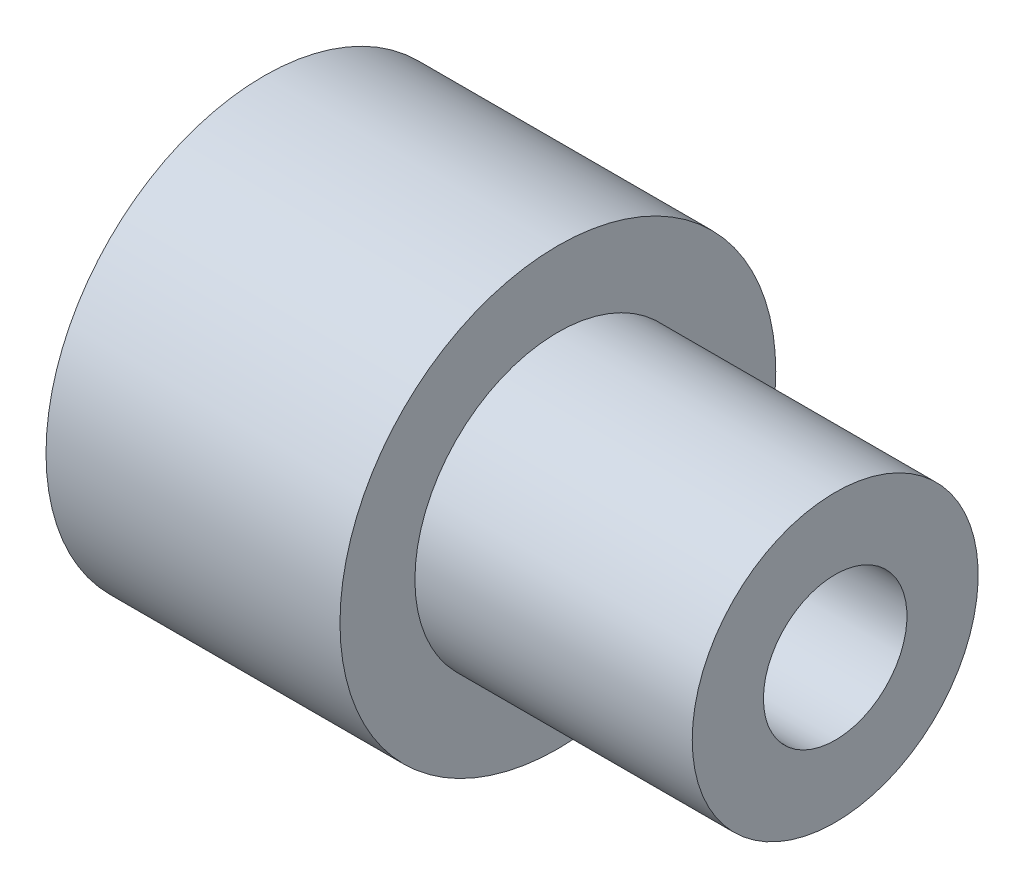
ISO-10303-21;
HEADER;
FILE_DESCRIPTION(('STEP AP214'),'2;1');
FILE_NAME('part.step','',(''),(''),'','','');
FILE_SCHEMA(('AUTOMOTIVE_DESIGN { 1 0 10303 214 1 1 1 1 }'));
ENDSEC;
DATA;
#1=APPLICATION_CONTEXT('core data for automotive mechanical design processes');
#2=APPLICATION_PROTOCOL_DEFINITION('international standard','automotive_design',2000,#1);
#3=PRODUCT_CONTEXT('',#1,'mechanical');
#4=PRODUCT('Part','Part','',(#3));
#5=PRODUCT_RELATED_PRODUCT_CATEGORY('part','',(#4));
#6=PRODUCT_DEFINITION_FORMATION('','',#4);
#7=PRODUCT_DEFINITION_CONTEXT('part definition',#1,'design');
#8=PRODUCT_DEFINITION('design','',#6,#7);
#9=PRODUCT_DEFINITION_SHAPE('','',#8);
#10=(LENGTH_UNIT() NAMED_UNIT(*) SI_UNIT(.MILLI.,.METRE.));
#11=(NAMED_UNIT(*) PLANE_ANGLE_UNIT() SI_UNIT($,.RADIAN.));
#12=(NAMED_UNIT(*) SI_UNIT($,.STERADIAN.) SOLID_ANGLE_UNIT());
#13=UNCERTAINTY_MEASURE_WITH_UNIT(LENGTH_MEASURE(1.E-05),#10,'distance_accuracy_value','');
#14=(GEOMETRIC_REPRESENTATION_CONTEXT(3) GLOBAL_UNCERTAINTY_ASSIGNED_CONTEXT((#13)) GLOBAL_UNIT_ASSIGNED_CONTEXT((#10,
#11,#12)) REPRESENTATION_CONTEXT('',''));
#15=CARTESIAN_POINT('',(0.,0.,0.));
#16=DIRECTION('',(0.,0.,1.));
#17=DIRECTION('',(1.,0.,0.));
#18=AXIS2_PLACEMENT_3D('',#15,#16,#17);
#19=CARTESIAN_POINT('',(0.,0.,0.));
#20=DIRECTION('',(1.,0.,0.));
#21=DIRECTION('',(0.,0.,-1.));
#22=AXIS2_PLACEMENT_3D('',#19,#20,#21);
#23=PLANE('',#22);
#24=CARTESIAN_POINT('',(0.,0.,0.));
#25=DIRECTION('',(-1.,0.,0.));
#26=DIRECTION('',(0.,0.,1.));
#27=AXIS2_PLACEMENT_3D('',#24,#25,#26);
#28=CIRCLE('',#27,1.24999999999999);
#29=CARTESIAN_POINT('',(0.,0.,1.24999999999999));
#30=VERTEX_POINT('',#29);
#31=EDGE_CURVE('E56',#30,#30,#28,.T.);
#32=ORIENTED_EDGE('',*,*,#31,.F.);
#33=EDGE_LOOP('',(#32));
#34=FACE_BOUND('',#33,.T.);
#35=CARTESIAN_POINT('',(0.,0.,0.));
#36=DIRECTION('',(-1.,0.,0.));
#37=DIRECTION('',(0.,0.,1.));
#38=AXIS2_PLACEMENT_3D('',#35,#36,#37);
#39=CIRCLE('',#38,3.795);
#40=CARTESIAN_POINT('',(0.,0.,3.795));
#41=VERTEX_POINT('',#40);
#42=EDGE_CURVE('E10',#41,#41,#39,.T.);
#43=ORIENTED_EDGE('',*,*,#42,.T.);
#44=EDGE_LOOP('',(#43));
#45=FACE_BOUND('',#44,.T.);
#46=ADVANCED_FACE('F34',(#34,#45),#23,.F.);
#47=CARTESIAN_POINT('',(0.,0.,0.));
#48=DIRECTION('',(-1.,0.,0.));
#49=DIRECTION('',(0.,0.,1.));
#50=AXIS2_PLACEMENT_3D('',#47,#48,#49);
#51=CYLINDRICAL_SURFACE('',#50,3.795);
#52=ORIENTED_EDGE('',*,*,#42,.F.);
#53=EDGE_LOOP('',(#52));
#54=FACE_BOUND('',#53,.T.);
#55=CARTESIAN_POINT('',(5.12,0.,0.));
#56=DIRECTION('',(-1.,0.,0.));
#57=DIRECTION('',(0.,0.,1.));
#58=AXIS2_PLACEMENT_3D('',#55,#56,#57);
#59=CIRCLE('',#58,3.795);
#60=CARTESIAN_POINT('',(5.12,0.,3.795));
#61=VERTEX_POINT('',#60);
#62=EDGE_CURVE('E40',#61,#61,#59,.T.);
#63=ORIENTED_EDGE('',*,*,#62,.T.);
#64=EDGE_LOOP('',(#63));
#65=FACE_BOUND('',#64,.T.);
#66=ADVANCED_FACE('F63',(#54,#65),#51,.T.);
#67=CARTESIAN_POINT('',(5.12,3.795,0.));
#68=DIRECTION('',(-1.,0.,0.));
#69=DIRECTION('',(0.,0.,1.));
#70=AXIS2_PLACEMENT_3D('',#67,#68,#69);
#71=PLANE('',#70);
#72=ORIENTED_EDGE('',*,*,#62,.F.);
#73=EDGE_LOOP('',(#72));
#74=FACE_BOUND('',#73,.T.);
#75=CARTESIAN_POINT('',(5.12,0.,0.));
#76=DIRECTION('',(-1.,0.,0.));
#77=DIRECTION('',(0.,0.,1.));
#78=AXIS2_PLACEMENT_3D('',#75,#76,#77);
#79=CIRCLE('',#78,2.49);
#80=CARTESIAN_POINT('',(5.12,0.,2.49));
#81=VERTEX_POINT('',#80);
#82=EDGE_CURVE('E44',#81,#81,#79,.T.);
#83=ORIENTED_EDGE('',*,*,#82,.T.);
#84=EDGE_LOOP('',(#83));
#85=FACE_BOUND('',#84,.T.);
#86=ADVANCED_FACE('F67',(#74,#85),#71,.F.);
#87=CARTESIAN_POINT('',(0.,0.,0.));
#88=DIRECTION('',(-1.,0.,0.));
#89=DIRECTION('',(0.,0.,1.));
#90=AXIS2_PLACEMENT_3D('',#87,#88,#89);
#91=CYLINDRICAL_SURFACE('',#90,2.49);
#92=ORIENTED_EDGE('',*,*,#82,.F.);
#93=EDGE_LOOP('',(#92));
#94=FACE_BOUND('',#93,.T.);
#95=CARTESIAN_POINT('',(9.95,0.,0.));
#96=DIRECTION('',(-1.,0.,0.));
#97=DIRECTION('',(0.,0.,1.));
#98=AXIS2_PLACEMENT_3D('',#95,#96,#97);
#99=CIRCLE('',#98,2.49);
#100=CARTESIAN_POINT('',(9.95,0.,2.49));
#101=VERTEX_POINT('',#100);
#102=EDGE_CURVE('E48',#101,#101,#99,.T.);
#103=ORIENTED_EDGE('',*,*,#102,.T.);
#104=EDGE_LOOP('',(#103));
#105=FACE_BOUND('',#104,.T.);
#106=ADVANCED_FACE('F72',(#94,#105),#91,.T.);
#107=CARTESIAN_POINT('',(9.95,2.49,0.));
#108=DIRECTION('',(-1.,0.,0.));
#109=DIRECTION('',(0.,0.,1.));
#110=AXIS2_PLACEMENT_3D('',#107,#108,#109);
#111=PLANE('',#110);
#112=CARTESIAN_POINT('',(9.95,0.,0.));
#113=DIRECTION('',(-1.,0.,0.));
#114=DIRECTION('',(0.,0.,1.));
#115=AXIS2_PLACEMENT_3D('',#112,#113,#114);
#116=CIRCLE('',#115,1.25);
#117=CARTESIAN_POINT('',(9.95,0.,1.25));
#118=VERTEX_POINT('',#117);
#119=EDGE_CURVE('E53',#118,#118,#116,.T.);
#120=ORIENTED_EDGE('',*,*,#119,.T.);
#121=EDGE_LOOP('',(#120));
#122=FACE_BOUND('',#121,.T.);
#123=ORIENTED_EDGE('',*,*,#102,.F.);
#124=EDGE_LOOP('',(#123));
#125=FACE_BOUND('',#124,.T.);
#126=ADVANCED_FACE('F78',(#122,#125),#111,.F.);
#127=CARTESIAN_POINT('',(0.,0.,0.));
#128=DIRECTION('',(-1.,0.,0.));
#129=DIRECTION('',(0.,0.,1.));
#130=AXIS2_PLACEMENT_3D('',#127,#128,#129);
#131=CYLINDRICAL_SURFACE('',#130,1.24999999999999);
#132=ORIENTED_EDGE('',*,*,#119,.F.);
#133=EDGE_LOOP('',(#132));
#134=FACE_BOUND('',#133,.T.);
#135=ORIENTED_EDGE('',*,*,#31,.T.);
#136=EDGE_LOOP('',(#135));
#137=FACE_BOUND('',#136,.T.);
#138=ADVANCED_FACE('F60',(#134,#137),#131,.F.);
#139=CLOSED_SHELL('',(#46,#66,#86,#106,#126,#138));
#140=MANIFOLD_SOLID_BREP('B2',#139);
#141=ADVANCED_BREP_SHAPE_REPRESENTATION('',(#18,#140),#14);
#142=SHAPE_DEFINITION_REPRESENTATION(#9,#141);
ENDSEC;
END-ISO-10303-21;
